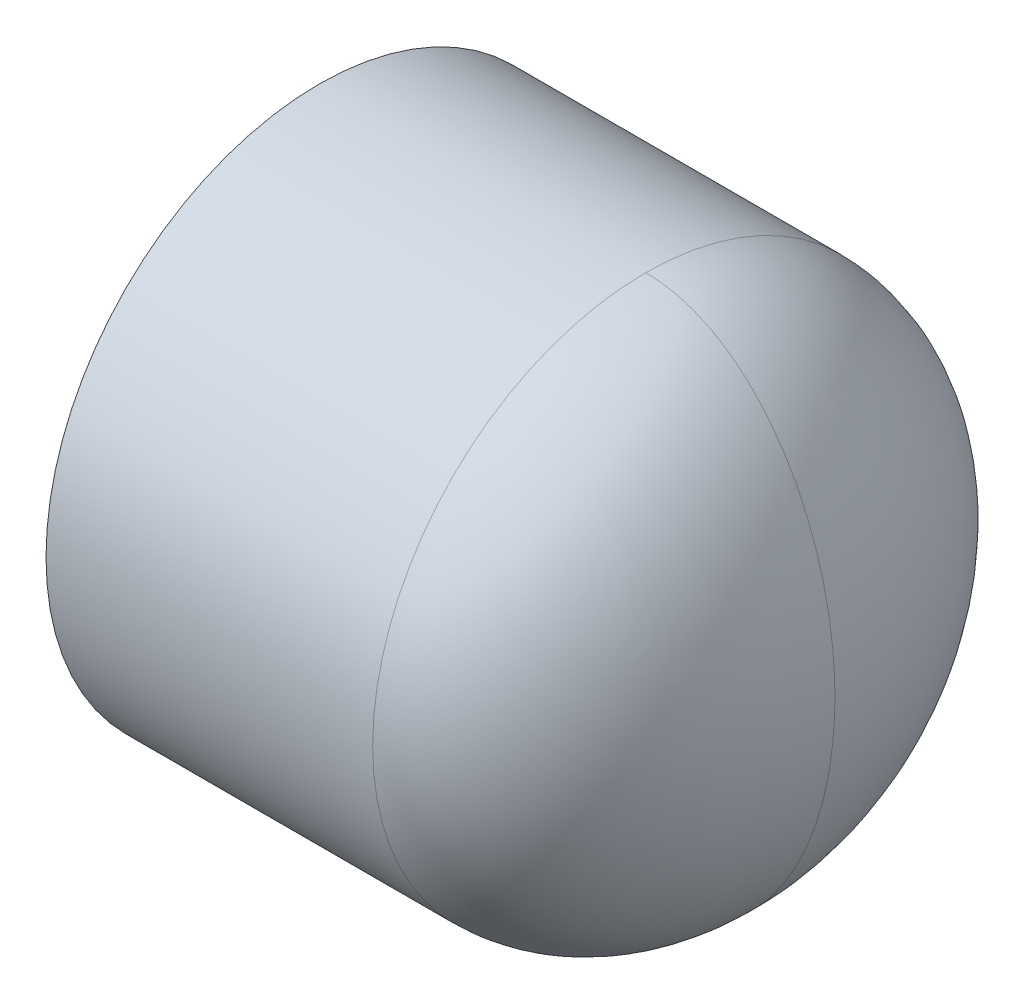
ISO-10303-21;
HEADER;
FILE_DESCRIPTION(('STEP AP214'),'2;1');
FILE_NAME('part.step','',(''),(''),'','','');
FILE_SCHEMA(('AUTOMOTIVE_DESIGN { 1 0 10303 214 1 1 1 1 }'));
ENDSEC;
DATA;
#1=APPLICATION_CONTEXT('core data for automotive mechanical design processes');
#2=APPLICATION_PROTOCOL_DEFINITION('international standard','automotive_design',2000,#1);
#3=PRODUCT_CONTEXT('',#1,'mechanical');
#4=PRODUCT('Part','Part','',(#3));
#5=PRODUCT_RELATED_PRODUCT_CATEGORY('part','',(#4));
#6=PRODUCT_DEFINITION_FORMATION('','',#4);
#7=PRODUCT_DEFINITION_CONTEXT('part definition',#1,'design');
#8=PRODUCT_DEFINITION('design','',#6,#7);
#9=PRODUCT_DEFINITION_SHAPE('','',#8);
#10=(LENGTH_UNIT() NAMED_UNIT(*) SI_UNIT(.MILLI.,.METRE.));
#11=(NAMED_UNIT(*) PLANE_ANGLE_UNIT() SI_UNIT($,.RADIAN.));
#12=(NAMED_UNIT(*) SI_UNIT($,.STERADIAN.) SOLID_ANGLE_UNIT());
#13=UNCERTAINTY_MEASURE_WITH_UNIT(LENGTH_MEASURE(1.E-05),#10,'distance_accuracy_value','');
#14=(GEOMETRIC_REPRESENTATION_CONTEXT(3) GLOBAL_UNCERTAINTY_ASSIGNED_CONTEXT((#13)) GLOBAL_UNIT_ASSIGNED_CONTEXT((#10,
#11,#12)) REPRESENTATION_CONTEXT('',''));
#15=CARTESIAN_POINT('',(0.,0.,0.));
#16=DIRECTION('',(0.,0.,1.));
#17=DIRECTION('',(1.,0.,0.));
#18=AXIS2_PLACEMENT_3D('',#15,#16,#17);
#19=CARTESIAN_POINT('',(12.3317,0.,0.));
#20=CARTESIAN_POINT('',(12.3317,0.,0.));
#21=CARTESIAN_POINT('',(12.3317,0.,0.));
#22=CARTESIAN_POINT('',(12.3317,0.,0.));
#23=CARTESIAN_POINT('',(12.3317,7.78170419472332,0.));
#24=CARTESIAN_POINT('',(12.3317,7.78170419472332,-15.5634083894466));
#25=CARTESIAN_POINT('',(12.3317,-7.78170419472332,-15.5634083894466));
#26=CARTESIAN_POINT('',(12.3317,-7.78170419472332,0.));
#27=CARTESIAN_POINT('',(8.99653523848432,13.2842,0.));
#28=CARTESIAN_POINT('',(8.99653523848432,13.2842,-26.5684));
#29=CARTESIAN_POINT('',(8.99653523848432,-13.2842,-26.5684));
#30=CARTESIAN_POINT('',(8.99653523848432,-13.2842,0.));
#31=CARTESIAN_POINT('',(4.2799,13.2842,0.));
#32=CARTESIAN_POINT('',(4.2799,13.2842,-26.5684));
#33=CARTESIAN_POINT('',(4.2799,-13.2842,-26.5684));
#34=CARTESIAN_POINT('',(4.2799,-13.2842,0.));
#35=(BOUNDED_SURFACE() B_SPLINE_SURFACE(3,3,((#19,#20,#21,#22),(#23,#24,#25,#26),(#27,#28,#29,
#30),(#31,#32,#33,#34)),.UNSPECIFIED.,.F.,.F.,.F.) B_SPLINE_SURFACE_WITH_KNOTS((4,4),(4,4),(0.,
1.),(0.,1.),.UNSPECIFIED.) GEOMETRIC_REPRESENTATION_ITEM() RATIONAL_B_SPLINE_SURFACE(((1.,
0.333333333333333,0.333333333333333,1.),(0.804737854124365,0.268245951374788,0.268245951374788,
0.804737854124365),(0.804737854124365,0.268245951374788,0.268245951374788,0.804737854124365),
(1.,0.333333333333333,0.333333333333333,1.))) REPRESENTATION_ITEM('') SURFACE());
#36=CARTESIAN_POINT('',(12.3317,0.,0.));
#37=CARTESIAN_POINT('',(12.3317,7.78170419472332,0.));
#38=CARTESIAN_POINT('',(8.99653523848432,13.2842,0.));
#39=CARTESIAN_POINT('',(4.2799,13.2842,0.));
#40=(BOUNDED_CURVE() B_SPLINE_CURVE(3,(#36,#37,#38,#39),.UNSPECIFIED.,.F.,
.F.) B_SPLINE_CURVE_WITH_KNOTS((4,4),(0.,1.),
.UNSPECIFIED.) CURVE() GEOMETRIC_REPRESENTATION_ITEM() RATIONAL_B_SPLINE_CURVE((1.,
0.804737854124365,0.804737854124365,1.)) REPRESENTATION_ITEM(''));
#41=CARTESIAN_POINT('',(4.27990000000001,13.2842,0.));
#42=VERTEX_POINT('',#41);
#43=CARTESIAN_POINT('',(12.3317,0.,0.));
#44=VERTEX_POINT('',#43);
#45=EDGE_CURVE('E53',#42,#44,#40,.F.);
#46=CARTESIAN_POINT('',(4.2799,0.,0.));
#47=DIRECTION('',(-1.,0.,0.));
#48=DIRECTION('',(0.,0.,1.));
#49=AXIS2_PLACEMENT_3D('',#46,#47,#48);
#50=CIRCLE('',#49,13.2842);
#51=CARTESIAN_POINT('',(4.27990000000001,-13.2842,0.));
#52=VERTEX_POINT('',#51);
#53=EDGE_CURVE('E49',#42,#52,#50,.T.);
#54=CARTESIAN_POINT('',(12.3317,0.,0.));
#55=CARTESIAN_POINT('',(12.3317,-7.78170419472332,2.68548547272072E-10));
#56=CARTESIAN_POINT('',(8.99653523848431,-13.2842,4.58441046125951E-10));
#57=CARTESIAN_POINT('',(4.2799,-13.2842,4.58441046125951E-10));
#58=(BOUNDED_CURVE() B_SPLINE_CURVE(3,(#54,#55,#56,#57),.UNSPECIFIED.,.F.,
.F.) B_SPLINE_CURVE_WITH_KNOTS((4,4),(0.,1.),
.UNSPECIFIED.) CURVE() GEOMETRIC_REPRESENTATION_ITEM() RATIONAL_B_SPLINE_CURVE((0.99999999996549,
0.804737854096594,0.804737854096594,0.99999999996549)) REPRESENTATION_ITEM(''));
#59=EDGE_CURVE('E51',#44,#52,#58,.T.);
#60=ORIENTED_EDGE('',*,*,#45,.F.);
#61=ORIENTED_EDGE('',*,*,#53,.T.);
#62=ORIENTED_EDGE('',*,*,#59,.F.);
#63=EDGE_LOOP('',(#60,#61,#62));
#64=FACE_BOUND('',#63,.T.);
#65=ADVANCED_FACE('F17',(#64),#35,.T.);
#66=CARTESIAN_POINT('',(12.3317,0.,0.));
#67=CARTESIAN_POINT('',(12.3317,0.,0.));
#68=CARTESIAN_POINT('',(12.3317,0.,0.));
#69=CARTESIAN_POINT('',(12.3317,0.,0.));
#70=CARTESIAN_POINT('',(12.3317,-7.78170419472332,0.));
#71=CARTESIAN_POINT('',(12.3317,-7.78170419472332,15.5634083894466));
#72=CARTESIAN_POINT('',(12.3317,7.78170419472332,15.5634083894466));
#73=CARTESIAN_POINT('',(12.3317,7.78170419472332,0.));
#74=CARTESIAN_POINT('',(8.99653523848432,-13.2842,0.));
#75=CARTESIAN_POINT('',(8.99653523848432,-13.2842,26.5684));
#76=CARTESIAN_POINT('',(8.99653523848432,13.2842,26.5684));
#77=CARTESIAN_POINT('',(8.99653523848432,13.2842,0.));
#78=CARTESIAN_POINT('',(4.2799,-13.2842,0.));
#79=CARTESIAN_POINT('',(4.2799,-13.2842,26.5684));
#80=CARTESIAN_POINT('',(4.2799,13.2842,26.5684));
#81=CARTESIAN_POINT('',(4.2799,13.2842,0.));
#82=(BOUNDED_SURFACE() B_SPLINE_SURFACE(3,3,((#66,#67,#68,#69),(#70,#71,#72,#73),(#74,#75,#76,
#77),(#78,#79,#80,#81)),.UNSPECIFIED.,.F.,.F.,.F.) B_SPLINE_SURFACE_WITH_KNOTS((4,4),(4,4),(0.,
1.),(0.,1.),.UNSPECIFIED.) GEOMETRIC_REPRESENTATION_ITEM() RATIONAL_B_SPLINE_SURFACE(((1.,
0.333333333333333,0.333333333333333,1.),(0.804737854124365,0.268245951374788,0.268245951374788,
0.804737854124365),(0.804737854124365,0.268245951374788,0.268245951374788,0.804737854124365),
(1.,0.333333333333333,0.333333333333333,1.))) REPRESENTATION_ITEM('') SURFACE());
#83=CARTESIAN_POINT('',(4.2799,0.,0.));
#84=DIRECTION('',(-1.,0.,0.));
#85=DIRECTION('',(0.,0.,1.));
#86=AXIS2_PLACEMENT_3D('',#83,#84,#85);
#87=CIRCLE('',#86,13.2842);
#88=EDGE_CURVE('E57',#52,#42,#87,.T.);
#89=ORIENTED_EDGE('',*,*,#59,.T.);
#90=ORIENTED_EDGE('',*,*,#88,.T.);
#91=ORIENTED_EDGE('',*,*,#45,.T.);
#92=EDGE_LOOP('',(#89,#90,#91));
#93=FACE_BOUND('',#92,.T.);
#94=ADVANCED_FACE('F60',(#93),#82,.T.);
#95=CARTESIAN_POINT('',(-16.0400999999998,0.,0.));
#96=DIRECTION('',(-1.,0.,0.));
#97=DIRECTION('',(0.,0.,1.));
#98=AXIS2_PLACEMENT_3D('',#95,#96,#97);
#99=CONICAL_SURFACE('',#98,13.4366,0.00749985937974589);
#100=CARTESIAN_POINT('',(-16.0400999999998,0.,0.));
#101=DIRECTION('',(-1.,0.,0.));
#102=DIRECTION('',(0.,0.,1.));
#103=AXIS2_PLACEMENT_3D('',#100,#101,#102);
#104=CIRCLE('',#103,13.4366);
#105=CARTESIAN_POINT('',(-16.0400999999998,0.,13.4366));
#106=VERTEX_POINT('',#105);
#107=EDGE_CURVE('E22',#106,#106,#104,.F.);
#108=ORIENTED_EDGE('',*,*,#107,.F.);
#109=EDGE_LOOP('',(#108));
#110=FACE_BOUND('',#109,.T.);
#111=ORIENTED_EDGE('',*,*,#53,.F.);
#112=ORIENTED_EDGE('',*,*,#88,.F.);
#113=EDGE_LOOP('',(#111,#112));
#114=FACE_BOUND('',#113,.T.);
#115=ADVANCED_FACE('F62',(#110,#114),#99,.F.);
#116=CARTESIAN_POINT('',(4.2799,-16.9926,0.));
#117=CARTESIAN_POINT('',(4.2799,-16.9926,33.9852));
#118=CARTESIAN_POINT('',(4.2799,16.9926,33.9852));
#119=CARTESIAN_POINT('',(4.2799,16.9926,0.));
#120=CARTESIAN_POINT('',(11.1688656637799,-16.9926,0.));
#121=CARTESIAN_POINT('',(11.1688656637799,-16.9926,33.9852));
#122=CARTESIAN_POINT('',(11.1688656637799,16.9926,33.9852));
#123=CARTESIAN_POINT('',(11.1688656637799,16.9926,0.));
#124=CARTESIAN_POINT('',(16.0401,-9.95403462001896,0.));
#125=CARTESIAN_POINT('',(16.0401,-9.95403462001896,19.9080692400379));
#126=CARTESIAN_POINT('',(16.0401,9.95403462001896,19.9080692400379));
#127=CARTESIAN_POINT('',(16.0401,9.95403462001896,0.));
#128=CARTESIAN_POINT('',(16.0401,0.,0.));
#129=CARTESIAN_POINT('',(16.0401,0.,0.));
#130=CARTESIAN_POINT('',(16.0401,0.,0.));
#131=CARTESIAN_POINT('',(16.0401,0.,0.));
#132=(BOUNDED_SURFACE() B_SPLINE_SURFACE(3,3,((#116,#117,#118,#119),(#120,#121,#122,#123),(#124,
#125,#126,#127),(#128,#129,#130,#131)),.UNSPECIFIED.,.F.,.F.,
.F.) B_SPLINE_SURFACE_WITH_KNOTS((4,4),(4,4),(0.,1.),(0.,1.),
.UNSPECIFIED.) GEOMETRIC_REPRESENTATION_ITEM() RATIONAL_B_SPLINE_SURFACE(((1.,0.333333333333333,
0.333333333333333,1.),(0.804737854124365,0.268245951374788,0.268245951374788,0.804737854124365),
(0.804737854124365,0.268245951374788,0.268245951374788,0.804737854124365),(1.,0.333333333333333,
0.333333333333333,1.))) REPRESENTATION_ITEM('') SURFACE());
#133=CARTESIAN_POINT('',(4.2799,0.,0.));
#134=DIRECTION('',(-1.,0.,0.));
#135=DIRECTION('',(0.,0.,1.));
#136=AXIS2_PLACEMENT_3D('',#133,#134,#135);
#137=CIRCLE('',#136,16.9926);
#138=CARTESIAN_POINT('',(4.2799,-16.9926,0.));
#139=VERTEX_POINT('',#138);
#140=CARTESIAN_POINT('',(4.2799,16.9926,0.));
#141=VERTEX_POINT('',#140);
#142=EDGE_CURVE('E87',#139,#141,#137,.T.);
#143=CARTESIAN_POINT('',(4.2799,-16.9926,0.));
#144=CARTESIAN_POINT('',(11.1688656637799,-16.9926,0.));
#145=CARTESIAN_POINT('',(16.0401,-9.95403462001896,0.));
#146=CARTESIAN_POINT('',(16.0401,0.,0.));
#147=(BOUNDED_CURVE() B_SPLINE_CURVE(3,(#143,#144,#145,#146),.UNSPECIFIED.,.F.,
.F.) B_SPLINE_CURVE_WITH_KNOTS((4,4),(0.,1.),
.UNSPECIFIED.) CURVE() GEOMETRIC_REPRESENTATION_ITEM() RATIONAL_B_SPLINE_CURVE((1.,
0.804737854124365,0.804737854124365,1.)) REPRESENTATION_ITEM(''));
#148=CARTESIAN_POINT('',(16.0401,0.,0.));
#149=VERTEX_POINT('',#148);
#150=EDGE_CURVE('E64',#149,#139,#147,.F.);
#151=CARTESIAN_POINT('',(4.2799,16.9926,0.));
#152=CARTESIAN_POINT('',(11.1688656637799,16.9926,0.));
#153=CARTESIAN_POINT('',(16.0401,9.95403462001896,0.));
#154=CARTESIAN_POINT('',(16.0401,0.,0.));
#155=(BOUNDED_CURVE() B_SPLINE_CURVE(3,(#151,#152,#153,#154),.UNSPECIFIED.,.F.,
.F.) B_SPLINE_CURVE_WITH_KNOTS((4,4),(0.,1.),
.UNSPECIFIED.) CURVE() GEOMETRIC_REPRESENTATION_ITEM() RATIONAL_B_SPLINE_CURVE((1.,
0.804737854124365,0.804737854124365,1.)) REPRESENTATION_ITEM(''));
#156=EDGE_CURVE('E36',#141,#149,#155,.T.);
#157=ORIENTED_EDGE('',*,*,#142,.F.);
#158=ORIENTED_EDGE('',*,*,#150,.F.);
#159=ORIENTED_EDGE('',*,*,#156,.F.);
#160=EDGE_LOOP('',(#157,#158,#159));
#161=FACE_BOUND('',#160,.T.);
#162=ADVANCED_FACE('F98',(#161),#132,.T.);
#163=CARTESIAN_POINT('',(4.2799,16.9926,0.));
#164=CARTESIAN_POINT('',(4.2799,16.9926,-33.9852));
#165=CARTESIAN_POINT('',(4.2799,-16.9926,-33.9852));
#166=CARTESIAN_POINT('',(4.2799,-16.9926,0.));
#167=CARTESIAN_POINT('',(11.1688656637799,16.9926,0.));
#168=CARTESIAN_POINT('',(11.1688656637799,16.9926,-33.9852));
#169=CARTESIAN_POINT('',(11.1688656637799,-16.9926,-33.9852));
#170=CARTESIAN_POINT('',(11.1688656637799,-16.9926,0.));
#171=CARTESIAN_POINT('',(16.0401,9.95403462001896,0.));
#172=CARTESIAN_POINT('',(16.0401,9.95403462001896,-19.9080692400379));
#173=CARTESIAN_POINT('',(16.0401,-9.95403462001893,-19.9080692400379));
#174=CARTESIAN_POINT('',(16.0401,-9.95403462001896,0.));
#175=CARTESIAN_POINT('',(16.0401,0.,0.));
#176=CARTESIAN_POINT('',(16.0401,0.,0.));
#177=CARTESIAN_POINT('',(16.0401,0.,0.));
#178=CARTESIAN_POINT('',(16.0401,0.,0.));
#179=(BOUNDED_SURFACE() B_SPLINE_SURFACE(3,3,((#163,#164,#165,#166),(#167,#168,#169,#170),(#171,
#172,#173,#174),(#175,#176,#177,#178)),.UNSPECIFIED.,.F.,.F.,
.F.) B_SPLINE_SURFACE_WITH_KNOTS((4,4),(4,4),(0.,1.),(0.,1.),
.UNSPECIFIED.) GEOMETRIC_REPRESENTATION_ITEM() RATIONAL_B_SPLINE_SURFACE(((1.,0.333333333333333,
0.333333333333333,1.),(0.804737854124365,0.268245951374788,0.268245951374788,0.804737854124365),
(0.804737854124365,0.268245951374788,0.268245951374788,0.804737854124365),(1.,0.333333333333333,
0.333333333333333,1.))) REPRESENTATION_ITEM('') SURFACE());
#180=CARTESIAN_POINT('',(4.2799,0.,0.));
#181=DIRECTION('',(-1.,0.,0.));
#182=DIRECTION('',(0.,0.,1.));
#183=AXIS2_PLACEMENT_3D('',#180,#181,#182);
#184=CIRCLE('',#183,16.9926);
#185=EDGE_CURVE('E28',#141,#139,#184,.T.);
#186=ORIENTED_EDGE('',*,*,#156,.T.);
#187=ORIENTED_EDGE('',*,*,#150,.T.);
#188=ORIENTED_EDGE('',*,*,#185,.F.);
#189=EDGE_LOOP('',(#186,#187,#188));
#190=FACE_BOUND('',#189,.T.);
#191=ADVANCED_FACE('F97',(#190),#179,.T.);
#192=CARTESIAN_POINT('',(-16.0401,-16.9926,0.));
#193=DIRECTION('',(-1.,0.,0.));
#194=DIRECTION('',(0.,0.,1.));
#195=AXIS2_PLACEMENT_3D('',#192,#193,#194);
#196=PLANE('',#195);
#197=ORIENTED_EDGE('',*,*,#107,.T.);
#198=EDGE_LOOP('',(#197));
#199=FACE_BOUND('',#198,.T.);
#200=CARTESIAN_POINT('',(-16.0401,0.,0.));
#201=DIRECTION('',(-1.,0.,0.));
#202=DIRECTION('',(0.,0.,1.));
#203=AXIS2_PLACEMENT_3D('',#200,#201,#202);
#204=CIRCLE('',#203,16.9926);
#205=CARTESIAN_POINT('',(-16.0401,0.,16.9926));
#206=VERTEX_POINT('',#205);
#207=EDGE_CURVE('E11',#206,#206,#204,.F.);
#208=ORIENTED_EDGE('',*,*,#207,.F.);
#209=EDGE_LOOP('',(#208));
#210=FACE_BOUND('',#209,.T.);
#211=ADVANCED_FACE('F106',(#199,#210),#196,.T.);
#212=CARTESIAN_POINT('',(-16.0401,0.,0.));
#213=DIRECTION('',(-1.,0.,0.));
#214=DIRECTION('',(0.,0.,1.));
#215=AXIS2_PLACEMENT_3D('',#212,#213,#214);
#216=CYLINDRICAL_SURFACE('',#215,16.9926);
#217=ORIENTED_EDGE('',*,*,#207,.T.);
#218=EDGE_LOOP('',(#217));
#219=FACE_BOUND('',#218,.T.);
#220=ORIENTED_EDGE('',*,*,#142,.T.);
#221=ORIENTED_EDGE('',*,*,#185,.T.);
#222=EDGE_LOOP('',(#220,#221));
#223=FACE_BOUND('',#222,.T.);
#224=ADVANCED_FACE('F95',(#219,#223),#216,.T.);
#225=CLOSED_SHELL('',(#65,#94,#115,#162,#191,#211,#224));
#226=MANIFOLD_SOLID_BREP('B1',#225);
#227=ADVANCED_BREP_SHAPE_REPRESENTATION('',(#18,#226),#14);
#228=SHAPE_DEFINITION_REPRESENTATION(#9,#227);
ENDSEC;
END-ISO-10303-21;
